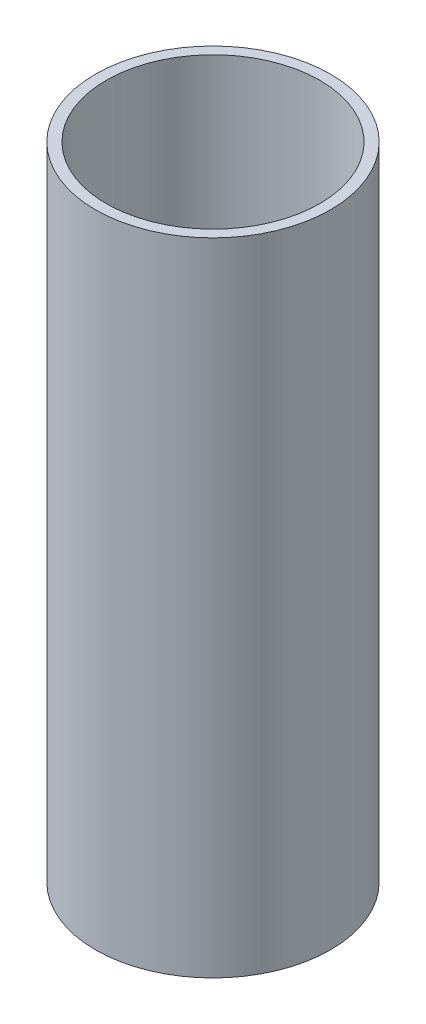
ISO-10303-21;
HEADER;
FILE_DESCRIPTION(('STEP AP214'),'2;1');
FILE_NAME('part.step','',(''),(''),'','','');
FILE_SCHEMA(('AUTOMOTIVE_DESIGN { 1 0 10303 214 1 1 1 1 }'));
ENDSEC;
DATA;
#1=APPLICATION_CONTEXT('core data for automotive mechanical design processes');
#2=APPLICATION_PROTOCOL_DEFINITION('international standard','automotive_design',2000,#1);
#3=PRODUCT_CONTEXT('',#1,'mechanical');
#4=PRODUCT('Part','Part','',(#3));
#5=PRODUCT_RELATED_PRODUCT_CATEGORY('part','',(#4));
#6=PRODUCT_DEFINITION_FORMATION('','',#4);
#7=PRODUCT_DEFINITION_CONTEXT('part definition',#1,'design');
#8=PRODUCT_DEFINITION('design','',#6,#7);
#9=PRODUCT_DEFINITION_SHAPE('','',#8);
#10=(LENGTH_UNIT() NAMED_UNIT(*) SI_UNIT(.MILLI.,.METRE.));
#11=(NAMED_UNIT(*) PLANE_ANGLE_UNIT() SI_UNIT($,.RADIAN.));
#12=(NAMED_UNIT(*) SI_UNIT($,.STERADIAN.) SOLID_ANGLE_UNIT());
#13=UNCERTAINTY_MEASURE_WITH_UNIT(LENGTH_MEASURE(1.E-05),#10,'distance_accuracy_value','');
#14=(GEOMETRIC_REPRESENTATION_CONTEXT(3) GLOBAL_UNCERTAINTY_ASSIGNED_CONTEXT((#13)) GLOBAL_UNIT_ASSIGNED_CONTEXT((#10,
#11,#12)) REPRESENTATION_CONTEXT('',''));
#15=CARTESIAN_POINT('',(0.,0.,0.));
#16=DIRECTION('',(0.,0.,1.));
#17=DIRECTION('',(1.,0.,0.));
#18=AXIS2_PLACEMENT_3D('',#15,#16,#17);
#19=CARTESIAN_POINT('',(0.,76.2,0.));
#20=DIRECTION('',(0.,1.,0.));
#21=DIRECTION('',(0.,0.,1.));
#22=AXIS2_PLACEMENT_3D('',#19,#20,#21);
#23=PLANE('',#22);
#24=CARTESIAN_POINT('',(0.,76.2,0.));
#25=DIRECTION('',(0.,1.,0.));
#26=DIRECTION('',(0.,0.,1.));
#27=AXIS2_PLACEMENT_3D('',#24,#25,#26);
#28=CIRCLE('',#27,13.97);
#29=CARTESIAN_POINT('',(0.,76.2,-13.97));
#30=VERTEX_POINT('',#29);
#31=EDGE_CURVE('E10',#30,#30,#28,.T.);
#32=ORIENTED_EDGE('',*,*,#31,.T.);
#33=EDGE_LOOP('',(#32));
#34=FACE_BOUND('',#33,.T.);
#35=CARTESIAN_POINT('',(0.,76.2,0.));
#36=DIRECTION('',(0.,1.,0.));
#37=DIRECTION('',(0.,0.,1.));
#38=AXIS2_PLACEMENT_3D('',#35,#36,#37);
#39=CIRCLE('',#38,12.7);
#40=CARTESIAN_POINT('',(0.,76.2,-12.7));
#41=VERTEX_POINT('',#40);
#42=EDGE_CURVE('E41',#41,#41,#39,.T.);
#43=ORIENTED_EDGE('',*,*,#42,.F.);
#44=EDGE_LOOP('',(#43));
#45=FACE_BOUND('',#44,.T.);
#46=ADVANCED_FACE('F30',(#34,#45),#23,.T.);
#47=CARTESIAN_POINT('',(0.,0.,0.));
#48=DIRECTION('',(0.,1.,0.));
#49=DIRECTION('',(0.,0.,1.));
#50=AXIS2_PLACEMENT_3D('',#47,#48,#49);
#51=PLANE('',#50);
#52=CARTESIAN_POINT('',(0.,0.,0.));
#53=DIRECTION('',(0.,1.,0.));
#54=DIRECTION('',(0.,0.,1.));
#55=AXIS2_PLACEMENT_3D('',#52,#53,#54);
#56=CIRCLE('',#55,13.97);
#57=CARTESIAN_POINT('',(0.,0.,-13.97));
#58=VERTEX_POINT('',#57);
#59=EDGE_CURVE('E34',#58,#58,#56,.T.);
#60=ORIENTED_EDGE('',*,*,#59,.F.);
#61=EDGE_LOOP('',(#60));
#62=FACE_BOUND('',#61,.T.);
#63=CARTESIAN_POINT('',(0.,0.,0.));
#64=DIRECTION('',(0.,1.,0.));
#65=DIRECTION('',(0.,0.,1.));
#66=AXIS2_PLACEMENT_3D('',#63,#64,#65);
#67=CIRCLE('',#66,12.7);
#68=CARTESIAN_POINT('',(0.,0.,-12.7));
#69=VERTEX_POINT('',#68);
#70=EDGE_CURVE('E43',#69,#69,#67,.T.);
#71=ORIENTED_EDGE('',*,*,#70,.T.);
#72=EDGE_LOOP('',(#71));
#73=FACE_BOUND('',#72,.T.);
#74=ADVANCED_FACE('F53',(#62,#73),#51,.F.);
#75=CARTESIAN_POINT('',(0.,76.2,0.));
#76=DIRECTION('',(0.,-1.,0.));
#77=DIRECTION('',(0.,0.,-1.));
#78=AXIS2_PLACEMENT_3D('',#75,#76,#77);
#79=CYLINDRICAL_SURFACE('',#78,13.97);
#80=CARTESIAN_POINT('',(0.,76.2,-13.97));
#81=CARTESIAN_POINT('',(0.,75.40625,-13.97));
#82=CARTESIAN_POINT('',(0.,74.6125,-13.97));
#83=CARTESIAN_POINT('',(0.,73.025,-13.97));
#84=CARTESIAN_POINT('',(0.,72.23125,-13.97));
#85=CARTESIAN_POINT('',(0.,70.64375,-13.97));
#86=CARTESIAN_POINT('',(0.,69.85,-13.97));
#87=CARTESIAN_POINT('',(0.,68.2625,-13.97));
#88=CARTESIAN_POINT('',(0.,67.46875,-13.97));
#89=CARTESIAN_POINT('',(0.,65.88125,-13.97));
#90=CARTESIAN_POINT('',(0.,65.0875,-13.97));
#91=CARTESIAN_POINT('',(0.,63.5,-13.97));
#92=CARTESIAN_POINT('',(0.,62.70625,-13.97));
#93=CARTESIAN_POINT('',(0.,61.11875,-13.97));
#94=CARTESIAN_POINT('',(0.,60.325,-13.97));
#95=CARTESIAN_POINT('',(0.,58.7375,-13.97));
#96=CARTESIAN_POINT('',(0.,57.94375,-13.97));
#97=CARTESIAN_POINT('',(0.,56.35625,-13.97));
#98=CARTESIAN_POINT('',(0.,55.5625,-13.97));
#99=CARTESIAN_POINT('',(0.,53.975,-13.97));
#100=CARTESIAN_POINT('',(0.,53.18125,-13.97));
#101=CARTESIAN_POINT('',(0.,51.59375,-13.97));
#102=CARTESIAN_POINT('',(0.,50.8,-13.97));
#103=CARTESIAN_POINT('',(0.,49.2125,-13.97));
#104=CARTESIAN_POINT('',(0.,48.41875,-13.97));
#105=CARTESIAN_POINT('',(0.,46.83125,-13.97));
#106=CARTESIAN_POINT('',(0.,46.0375,-13.97));
#107=CARTESIAN_POINT('',(0.,44.45,-13.97));
#108=CARTESIAN_POINT('',(0.,43.65625,-13.97));
#109=CARTESIAN_POINT('',(0.,42.06875,-13.97));
#110=CARTESIAN_POINT('',(0.,41.275,-13.97));
#111=CARTESIAN_POINT('',(0.,39.6875,-13.97));
#112=CARTESIAN_POINT('',(0.,38.89375,-13.97));
#113=CARTESIAN_POINT('',(0.,37.30625,-13.97));
#114=CARTESIAN_POINT('',(0.,36.5125,-13.97));
#115=CARTESIAN_POINT('',(0.,34.925,-13.97));
#116=CARTESIAN_POINT('',(0.,34.13125,-13.97));
#117=CARTESIAN_POINT('',(0.,32.54375,-13.97));
#118=CARTESIAN_POINT('',(0.,31.75,-13.97));
#119=CARTESIAN_POINT('',(0.,30.1625,-13.97));
#120=CARTESIAN_POINT('',(0.,29.36875,-13.97));
#121=CARTESIAN_POINT('',(0.,27.78125,-13.97));
#122=CARTESIAN_POINT('',(0.,26.9875,-13.97));
#123=CARTESIAN_POINT('',(0.,25.4,-13.97));
#124=CARTESIAN_POINT('',(0.,24.60625,-13.97));
#125=CARTESIAN_POINT('',(0.,23.01875,-13.97));
#126=CARTESIAN_POINT('',(0.,22.225,-13.97));
#127=CARTESIAN_POINT('',(0.,20.6375,-13.97));
#128=CARTESIAN_POINT('',(0.,19.84375,-13.97));
#129=CARTESIAN_POINT('',(0.,18.25625,-13.97));
#130=CARTESIAN_POINT('',(0.,17.4625,-13.97));
#131=CARTESIAN_POINT('',(0.,15.875,-13.97));
#132=CARTESIAN_POINT('',(0.,15.08125,-13.97));
#133=CARTESIAN_POINT('',(0.,13.49375,-13.97));
#134=CARTESIAN_POINT('',(0.,12.7,-13.97));
#135=CARTESIAN_POINT('',(0.,11.1125,-13.97));
#136=CARTESIAN_POINT('',(0.,10.31875,-13.97));
#137=CARTESIAN_POINT('',(0.,8.73125,-13.97));
#138=CARTESIAN_POINT('',(0.,7.93750000000001,-13.97));
#139=CARTESIAN_POINT('',(0.,6.35,-13.97));
#140=CARTESIAN_POINT('',(0.,5.55625,-13.97));
#141=CARTESIAN_POINT('',(0.,3.96875,-13.97));
#142=CARTESIAN_POINT('',(0.,3.175,-13.97));
#143=CARTESIAN_POINT('',(0.,1.5875,-13.97));
#144=CARTESIAN_POINT('',(0.,0.793750000000001,-13.97));
#145=CARTESIAN_POINT('',(0.,0.,-13.97));
#146=B_SPLINE_CURVE_WITH_KNOTS('',3,(#80,#81,#82,#83,#84,#85,#86,#87,#88,#89,#90,#91,#92,#93,
#94,#95,#96,#97,#98,#99,#100,#101,#102,#103,#104,#105,#106,#107,#108,#109,#110,#111,#112,#113,
#114,#115,#116,#117,#118,#119,#120,#121,#122,#123,#124,#125,#126,#127,#128,#129,#130,#131,#132,
#133,#134,#135,#136,#137,#138,#139,#140,#141,#142,#143,#144,#145),.UNSPECIFIED.,.F.,.F.,(4,2,2,
2,2,2,2,2,2,2,2,2,2,2,2,2,2,2,2,2,2,2,2,2,2,2,2,2,2,2,2,2,4),(0.,2.38124999999999,
4.76249999999999,7.14374999999999,9.52499999999999,11.90625,14.2875,16.66875,19.05,21.43125,
23.8125,26.19375,28.575,30.95625,33.3375,35.71875,38.1,40.48125,42.8625,45.24375,47.625,
50.00625,52.3875,54.76875,57.15,59.53125,61.9125,64.29375,66.675,69.05625,71.4375,73.81875,
76.2),.UNSPECIFIED.);
#147=EDGE_CURVE('BSEAM32',#30,#58,#146,.T.);
#148=ORIENTED_EDGE('',*,*,#31,.F.);
#149=ORIENTED_EDGE('',*,*,#59,.T.);
#150=ORIENTED_EDGE('',*,*,#147,.T.);
#151=ORIENTED_EDGE('',*,*,#147,.F.);
#152=EDGE_LOOP('',(#148,#150,#149,#151));
#153=FACE_BOUND('',#152,.T.);
#154=ADVANCED_FACE('F32',(#153),#79,.T.);
#155=CARTESIAN_POINT('',(0.,76.2,0.));
#156=DIRECTION('',(0.,-1.,0.));
#157=DIRECTION('',(0.,0.,-1.));
#158=AXIS2_PLACEMENT_3D('',#155,#156,#157);
#159=CYLINDRICAL_SURFACE('',#158,12.7);
#160=CARTESIAN_POINT('',(0.,76.2,-12.7));
#161=CARTESIAN_POINT('',(0.,75.40625,-12.7));
#162=CARTESIAN_POINT('',(0.,74.6125,-12.7));
#163=CARTESIAN_POINT('',(0.,73.025,-12.7));
#164=CARTESIAN_POINT('',(0.,72.23125,-12.7));
#165=CARTESIAN_POINT('',(0.,70.64375,-12.7));
#166=CARTESIAN_POINT('',(0.,69.85,-12.7));
#167=CARTESIAN_POINT('',(0.,68.2625,-12.7));
#168=CARTESIAN_POINT('',(0.,67.46875,-12.7));
#169=CARTESIAN_POINT('',(0.,65.88125,-12.7));
#170=CARTESIAN_POINT('',(0.,65.0875,-12.7));
#171=CARTESIAN_POINT('',(0.,63.5,-12.7));
#172=CARTESIAN_POINT('',(0.,62.70625,-12.7));
#173=CARTESIAN_POINT('',(0.,61.11875,-12.7));
#174=CARTESIAN_POINT('',(0.,60.325,-12.7));
#175=CARTESIAN_POINT('',(0.,58.7375,-12.7));
#176=CARTESIAN_POINT('',(0.,57.94375,-12.7));
#177=CARTESIAN_POINT('',(0.,56.35625,-12.7));
#178=CARTESIAN_POINT('',(0.,55.5625,-12.7));
#179=CARTESIAN_POINT('',(0.,53.975,-12.7));
#180=CARTESIAN_POINT('',(0.,53.18125,-12.7));
#181=CARTESIAN_POINT('',(0.,51.59375,-12.7));
#182=CARTESIAN_POINT('',(0.,50.8,-12.7));
#183=CARTESIAN_POINT('',(0.,49.2125,-12.7));
#184=CARTESIAN_POINT('',(0.,48.41875,-12.7));
#185=CARTESIAN_POINT('',(0.,46.83125,-12.7));
#186=CARTESIAN_POINT('',(0.,46.0375,-12.7));
#187=CARTESIAN_POINT('',(0.,44.45,-12.7));
#188=CARTESIAN_POINT('',(0.,43.65625,-12.7));
#189=CARTESIAN_POINT('',(0.,42.06875,-12.7));
#190=CARTESIAN_POINT('',(0.,41.275,-12.7));
#191=CARTESIAN_POINT('',(0.,39.6875,-12.7));
#192=CARTESIAN_POINT('',(0.,38.89375,-12.7));
#193=CARTESIAN_POINT('',(0.,37.30625,-12.7));
#194=CARTESIAN_POINT('',(0.,36.5125,-12.7));
#195=CARTESIAN_POINT('',(0.,34.925,-12.7));
#196=CARTESIAN_POINT('',(0.,34.13125,-12.7));
#197=CARTESIAN_POINT('',(0.,32.54375,-12.7));
#198=CARTESIAN_POINT('',(0.,31.75,-12.7));
#199=CARTESIAN_POINT('',(0.,30.1625,-12.7));
#200=CARTESIAN_POINT('',(0.,29.36875,-12.7));
#201=CARTESIAN_POINT('',(0.,27.78125,-12.7));
#202=CARTESIAN_POINT('',(0.,26.9875,-12.7));
#203=CARTESIAN_POINT('',(0.,25.4,-12.7));
#204=CARTESIAN_POINT('',(0.,24.60625,-12.7));
#205=CARTESIAN_POINT('',(0.,23.01875,-12.7));
#206=CARTESIAN_POINT('',(0.,22.225,-12.7));
#207=CARTESIAN_POINT('',(0.,20.6375,-12.7));
#208=CARTESIAN_POINT('',(0.,19.84375,-12.7));
#209=CARTESIAN_POINT('',(0.,18.25625,-12.7));
#210=CARTESIAN_POINT('',(0.,17.4625,-12.7));
#211=CARTESIAN_POINT('',(0.,15.875,-12.7));
#212=CARTESIAN_POINT('',(0.,15.08125,-12.7));
#213=CARTESIAN_POINT('',(0.,13.49375,-12.7));
#214=CARTESIAN_POINT('',(0.,12.7,-12.7));
#215=CARTESIAN_POINT('',(0.,11.1125,-12.7));
#216=CARTESIAN_POINT('',(0.,10.31875,-12.7));
#217=CARTESIAN_POINT('',(0.,8.73125,-12.7));
#218=CARTESIAN_POINT('',(0.,7.93750000000001,-12.7));
#219=CARTESIAN_POINT('',(0.,6.35,-12.7));
#220=CARTESIAN_POINT('',(0.,5.55625,-12.7));
#221=CARTESIAN_POINT('',(0.,3.96875,-12.7));
#222=CARTESIAN_POINT('',(0.,3.175,-12.7));
#223=CARTESIAN_POINT('',(0.,1.5875,-12.7));
#224=CARTESIAN_POINT('',(0.,0.793750000000001,-12.7));
#225=CARTESIAN_POINT('',(0.,0.,-12.7));
#226=B_SPLINE_CURVE_WITH_KNOTS('',3,(#160,#161,#162,#163,#164,#165,#166,#167,#168,#169,#170,
#171,#172,#173,#174,#175,#176,#177,#178,#179,#180,#181,#182,#183,#184,#185,#186,#187,#188,#189,
#190,#191,#192,#193,#194,#195,#196,#197,#198,#199,#200,#201,#202,#203,#204,#205,#206,#207,#208,
#209,#210,#211,#212,#213,#214,#215,#216,#217,#218,#219,#220,#221,#222,#223,#224,#225),
.UNSPECIFIED.,.F.,.F.,(4,2,2,2,2,2,2,2,2,2,2,2,2,2,2,2,2,2,2,2,2,2,2,2,2,2,2,2,2,2,2,2,4),(0.,
2.38124999999999,4.76249999999999,7.14374999999999,9.52499999999999,11.90625,14.2875,16.66875,
19.05,21.43125,23.8125,26.19375,28.575,30.95625,33.3375,35.71875,38.1,40.48125,42.8625,45.24375,
47.625,50.00625,52.3875,54.76875,57.15,59.53125,61.9125,64.29375,66.675,69.05625,71.4375,
73.81875,76.2),.UNSPECIFIED.);
#227=EDGE_CURVE('BSEAM49',#41,#69,#226,.T.);
#228=ORIENTED_EDGE('',*,*,#42,.T.);
#229=ORIENTED_EDGE('',*,*,#70,.F.);
#230=ORIENTED_EDGE('',*,*,#227,.T.);
#231=ORIENTED_EDGE('',*,*,#227,.F.);
#232=EDGE_LOOP('',(#228,#230,#229,#231));
#233=FACE_BOUND('',#232,.T.);
#234=ADVANCED_FACE('F49',(#233),#159,.F.);
#235=CLOSED_SHELL('',(#46,#74,#154,#234));
#236=MANIFOLD_SOLID_BREP('B2',#235);
#237=ADVANCED_BREP_SHAPE_REPRESENTATION('',(#18,#236),#14);
#238=SHAPE_DEFINITION_REPRESENTATION(#9,#237);
ENDSEC;
END-ISO-10303-21;
